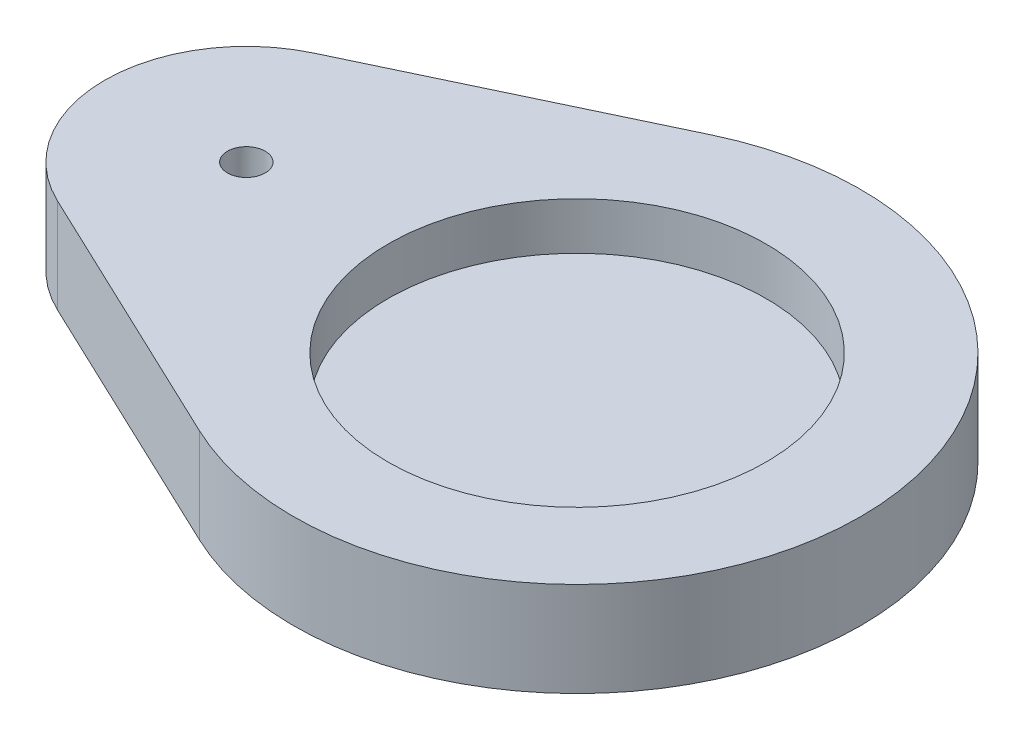
ISO-10303-21;
HEADER;
FILE_DESCRIPTION(('STEP AP214'),'2;1');
FILE_NAME('part.step','',(''),(''),'','','');
FILE_SCHEMA(('AUTOMOTIVE_DESIGN { 1 0 10303 214 1 1 1 1 }'));
ENDSEC;
DATA;
#1=APPLICATION_CONTEXT('core data for automotive mechanical design processes');
#2=APPLICATION_PROTOCOL_DEFINITION('international standard','automotive_design',2000,#1);
#3=PRODUCT_CONTEXT('',#1,'mechanical');
#4=PRODUCT('Part','Part','',(#3));
#5=PRODUCT_RELATED_PRODUCT_CATEGORY('part','',(#4));
#6=PRODUCT_DEFINITION_FORMATION('','',#4);
#7=PRODUCT_DEFINITION_CONTEXT('part definition',#1,'design');
#8=PRODUCT_DEFINITION('design','',#6,#7);
#9=PRODUCT_DEFINITION_SHAPE('','',#8);
#10=(LENGTH_UNIT() NAMED_UNIT(*) SI_UNIT(.MILLI.,.METRE.));
#11=(NAMED_UNIT(*) PLANE_ANGLE_UNIT() SI_UNIT($,.RADIAN.));
#12=(NAMED_UNIT(*) SI_UNIT($,.STERADIAN.) SOLID_ANGLE_UNIT());
#13=UNCERTAINTY_MEASURE_WITH_UNIT(LENGTH_MEASURE(1.E-05),#10,'distance_accuracy_value','');
#14=(GEOMETRIC_REPRESENTATION_CONTEXT(3) GLOBAL_UNCERTAINTY_ASSIGNED_CONTEXT((#13)) GLOBAL_UNIT_ASSIGNED_CONTEXT((#10,
#11,#12)) REPRESENTATION_CONTEXT('',''));
#15=CARTESIAN_POINT('',(0.,0.,0.));
#16=DIRECTION('',(0.,0.,1.));
#17=DIRECTION('',(1.,0.,0.));
#18=AXIS2_PLACEMENT_3D('',#15,#16,#17);
#19=CARTESIAN_POINT('',(-70.,20.,0.));
#20=DIRECTION('',(0.,-1.,0.));
#21=DIRECTION('',(0.,0.,-1.));
#22=AXIS2_PLACEMENT_3D('',#19,#20,#21);
#23=CYLINDRICAL_SURFACE('',#22,4.00000000000001);
#24=CARTESIAN_POINT('',(-70.,20.,0.));
#25=DIRECTION('',(0.,1.,0.));
#26=DIRECTION('',(0.,0.,1.));
#27=AXIS2_PLACEMENT_3D('',#24,#25,#26);
#28=CIRCLE('',#27,4.00000000000001);
#29=CARTESIAN_POINT('',(-70.,20.,4.00000000000001));
#30=VERTEX_POINT('',#29);
#31=EDGE_CURVE('E106',#30,#30,#28,.T.);
#32=ORIENTED_EDGE('',*,*,#31,.T.);
#33=EDGE_LOOP('',(#32));
#34=FACE_BOUND('',#33,.T.);
#35=CARTESIAN_POINT('',(-70.,5.,0.));
#36=DIRECTION('',(0.,-1.,0.));
#37=DIRECTION('',(0.,0.,-1.));
#38=AXIS2_PLACEMENT_3D('',#35,#36,#37);
#39=CIRCLE('',#38,4.00000000000001);
#40=CARTESIAN_POINT('',(-70.,5.,-4.00000000000001));
#41=VERTEX_POINT('',#40);
#42=EDGE_CURVE('E37',#41,#41,#39,.T.);
#43=ORIENTED_EDGE('',*,*,#42,.T.);
#44=EDGE_LOOP('',(#43));
#45=FACE_BOUND('',#44,.T.);
#46=ADVANCED_FACE('F33',(#34,#45),#23,.F.);
#47=CARTESIAN_POINT('',(0.,20.,0.));
#48=DIRECTION('',(0.,-1.,0.));
#49=DIRECTION('',(0.,0.,-1.));
#50=AXIS2_PLACEMENT_3D('',#47,#48,#49);
#51=CYLINDRICAL_SURFACE('',#50,60.);
#52=CARTESIAN_POINT('',(0.,20.,0.));
#53=DIRECTION('',(0.,1.,0.));
#54=DIRECTION('',(0.,0.,1.));
#55=AXIS2_PLACEMENT_3D('',#52,#53,#54);
#56=CIRCLE('',#55,60.);
#57=CARTESIAN_POINT('',(-25.7142857142857,20.,54.2104741743151));
#58=VERTEX_POINT('',#57);
#59=CARTESIAN_POINT('',(-25.7142857142857,20.,-54.2104741743151));
#60=VERTEX_POINT('',#59);
#61=EDGE_CURVE('E11',#58,#60,#56,.T.);
#62=ORIENTED_EDGE('',*,*,#61,.F.);
#63=DIRECTION('',(0.,-1.,0.));
#64=VECTOR('',#63,1.);
#65=CARTESIAN_POINT('',(-25.7142857142857,20.,54.2104741743151));
#66=LINE('',#65,#64);
#67=CARTESIAN_POINT('',(-25.7142857142857,0.,54.2104741743151));
#68=VERTEX_POINT('',#67);
#69=EDGE_CURVE('E79',#58,#68,#66,.T.);
#70=ORIENTED_EDGE('',*,*,#69,.T.);
#71=CARTESIAN_POINT('',(0.,0.,0.));
#72=DIRECTION('',(0.,1.,0.));
#73=DIRECTION('',(0.,0.,1.));
#74=AXIS2_PLACEMENT_3D('',#71,#72,#73);
#75=CIRCLE('',#74,60.);
#76=CARTESIAN_POINT('',(-25.7142857142857,0.,-54.2104741743151));
#77=VERTEX_POINT('',#76);
#78=EDGE_CURVE('E42',#68,#77,#75,.T.);
#79=ORIENTED_EDGE('',*,*,#78,.T.);
#80=DIRECTION('',(0.,-1.,0.));
#81=VECTOR('',#80,1.);
#82=CARTESIAN_POINT('',(-25.7142857142857,20.,-54.2104741743151));
#83=LINE('',#82,#81);
#84=EDGE_CURVE('E53',#60,#77,#83,.T.);
#85=ORIENTED_EDGE('',*,*,#84,.F.);
#86=EDGE_LOOP('',(#62,#70,#79,#85));
#87=FACE_BOUND('',#86,.T.);
#88=ADVANCED_FACE('F35',(#87),#51,.T.);
#89=CARTESIAN_POINT('',(0.,20.,0.));
#90=DIRECTION('',(0.,1.,0.));
#91=DIRECTION('',(0.,0.,1.));
#92=AXIS2_PLACEMENT_3D('',#89,#90,#91);
#93=PLANE('',#92);
#94=CARTESIAN_POINT('',(0.,20.,0.));
#95=DIRECTION('',(0.,1.,0.));
#96=DIRECTION('',(0.,0.,1.));
#97=AXIS2_PLACEMENT_3D('',#94,#95,#96);
#98=CIRCLE('',#97,40.);
#99=CARTESIAN_POINT('',(0.,20.,40.));
#100=VERTEX_POINT('',#99);
#101=EDGE_CURVE('E111',#100,#100,#98,.T.);
#102=ORIENTED_EDGE('',*,*,#101,.F.);
#103=EDGE_LOOP('',(#102));
#104=FACE_BOUND('',#103,.T.);
#105=ORIENTED_EDGE('',*,*,#61,.T.);
#106=DIRECTION('',(-0.903507902905251,0.,0.428571428571428));
#107=VECTOR('',#106,1.);
#108=CARTESIAN_POINT('',(-82.8571428571429,20.,-27.1052370871575));
#109=LINE('',#108,#107);
#110=CARTESIAN_POINT('',(-82.8571428571429,20.,-27.1052370871575));
#111=VERTEX_POINT('',#110);
#112=EDGE_CURVE('E81',#60,#111,#109,.T.);
#113=ORIENTED_EDGE('',*,*,#112,.T.);
#114=CARTESIAN_POINT('',(-70.,20.,0.));
#115=DIRECTION('',(0.,1.,0.));
#116=DIRECTION('',(0.,0.,1.));
#117=AXIS2_PLACEMENT_3D('',#114,#115,#116);
#118=CIRCLE('',#117,30.);
#119=CARTESIAN_POINT('',(-82.8571428571428,20.,27.1052370871575));
#120=VERTEX_POINT('',#119);
#121=EDGE_CURVE('E82',#111,#120,#118,.T.);
#122=ORIENTED_EDGE('',*,*,#121,.T.);
#123=DIRECTION('',(0.903507902905251,0.,0.428571428571429));
#124=VECTOR('',#123,1.);
#125=CARTESIAN_POINT('',(-82.8571428571428,20.,27.1052370871575));
#126=LINE('',#125,#124);
#127=EDGE_CURVE('E72',#120,#58,#126,.T.);
#128=ORIENTED_EDGE('',*,*,#127,.T.);
#129=EDGE_LOOP('',(#105,#113,#122,#128));
#130=FACE_BOUND('',#129,.T.);
#131=ORIENTED_EDGE('',*,*,#31,.F.);
#132=EDGE_LOOP('',(#131));
#133=FACE_BOUND('',#132,.T.);
#134=ADVANCED_FACE('F85',(#104,#130,#133),#93,.T.);
#135=CARTESIAN_POINT('',(0.,0.,0.));
#136=DIRECTION('',(0.,1.,0.));
#137=DIRECTION('',(0.,0.,1.));
#138=AXIS2_PLACEMENT_3D('',#135,#136,#137);
#139=PLANE('',#138);
#140=CARTESIAN_POINT('',(-70.,0.,0.));
#141=DIRECTION('',(0.,-1.,0.));
#142=DIRECTION('',(0.,0.,-1.));
#143=AXIS2_PLACEMENT_3D('',#140,#141,#142);
#144=CIRCLE('',#143,12.);
#145=CARTESIAN_POINT('',(-70.,0.,-12.));
#146=VERTEX_POINT('',#145);
#147=EDGE_CURVE('E116',#146,#146,#144,.T.);
#148=ORIENTED_EDGE('',*,*,#147,.F.);
#149=EDGE_LOOP('',(#148));
#150=FACE_BOUND('',#149,.T.);
#151=ORIENTED_EDGE('',*,*,#78,.F.);
#152=DIRECTION('',(0.903507902905251,0.,0.428571428571429));
#153=VECTOR('',#152,1.);
#154=CARTESIAN_POINT('',(-82.8571428571428,0.,27.1052370871575));
#155=LINE('',#154,#153);
#156=CARTESIAN_POINT('',(-82.8571428571428,0.,27.1052370871575));
#157=VERTEX_POINT('',#156);
#158=EDGE_CURVE('E103',#157,#68,#155,.T.);
#159=ORIENTED_EDGE('',*,*,#158,.F.);
#160=CARTESIAN_POINT('',(-70.,0.,0.));
#161=DIRECTION('',(0.,1.,0.));
#162=DIRECTION('',(0.,0.,1.));
#163=AXIS2_PLACEMENT_3D('',#160,#161,#162);
#164=CIRCLE('',#163,30.);
#165=CARTESIAN_POINT('',(-82.8571428571429,0.,-27.1052370871575));
#166=VERTEX_POINT('',#165);
#167=EDGE_CURVE('E95',#166,#157,#164,.T.);
#168=ORIENTED_EDGE('',*,*,#167,.F.);
#169=DIRECTION('',(-0.903507902905251,0.,0.428571428571428));
#170=VECTOR('',#169,1.);
#171=CARTESIAN_POINT('',(-82.8571428571429,0.,-27.1052370871575));
#172=LINE('',#171,#170);
#173=EDGE_CURVE('E91',#77,#166,#172,.T.);
#174=ORIENTED_EDGE('',*,*,#173,.F.);
#175=EDGE_LOOP('',(#151,#159,#168,#174));
#176=FACE_BOUND('',#175,.T.);
#177=ADVANCED_FACE('F155',(#150,#176),#139,.F.);
#178=CARTESIAN_POINT('',(-70.,20.,0.));
#179=DIRECTION('',(0.,-1.,0.));
#180=DIRECTION('',(0.,0.,-1.));
#181=AXIS2_PLACEMENT_3D('',#178,#179,#180);
#182=CYLINDRICAL_SURFACE('',#181,30.);
#183=ORIENTED_EDGE('',*,*,#167,.T.);
#184=DIRECTION('',(0.,-1.,0.));
#185=VECTOR('',#184,1.);
#186=CARTESIAN_POINT('',(-82.8571428571428,20.,27.1052370871575));
#187=LINE('',#186,#185);
#188=EDGE_CURVE('E77',#120,#157,#187,.T.);
#189=ORIENTED_EDGE('',*,*,#188,.F.);
#190=ORIENTED_EDGE('',*,*,#121,.F.);
#191=DIRECTION('',(0.,-1.,0.));
#192=VECTOR('',#191,1.);
#193=CARTESIAN_POINT('',(-82.8571428571429,20.,-27.1052370871575));
#194=LINE('',#193,#192);
#195=EDGE_CURVE('E100',#111,#166,#194,.T.);
#196=ORIENTED_EDGE('',*,*,#195,.T.);
#197=EDGE_LOOP('',(#183,#189,#190,#196));
#198=FACE_BOUND('',#197,.T.);
#199=ADVANCED_FACE('F93',(#198),#182,.T.);
#200=CARTESIAN_POINT('',(-82.8571428571428,20.,27.1052370871575));
#201=DIRECTION('',(0.428571428571429,0.,-0.903507902905251));
#202=DIRECTION('',(-0.903507902905251,0.,-0.428571428571429));
#203=AXIS2_PLACEMENT_3D('',#200,#201,#202);
#204=PLANE('',#203);
#205=ORIENTED_EDGE('',*,*,#158,.T.);
#206=ORIENTED_EDGE('',*,*,#69,.F.);
#207=ORIENTED_EDGE('',*,*,#127,.F.);
#208=ORIENTED_EDGE('',*,*,#188,.T.);
#209=EDGE_LOOP('',(#205,#206,#207,#208));
#210=FACE_BOUND('',#209,.T.);
#211=ADVANCED_FACE('F75',(#210),#204,.F.);
#212=CARTESIAN_POINT('',(-82.8571428571429,20.,-27.1052370871575));
#213=DIRECTION('',(0.428571428571428,0.,0.903507902905251));
#214=DIRECTION('',(0.903507902905251,0.,-0.428571428571428));
#215=AXIS2_PLACEMENT_3D('',#212,#213,#214);
#216=PLANE('',#215);
#217=ORIENTED_EDGE('',*,*,#173,.T.);
#218=ORIENTED_EDGE('',*,*,#195,.F.);
#219=ORIENTED_EDGE('',*,*,#112,.F.);
#220=ORIENTED_EDGE('',*,*,#84,.T.);
#221=EDGE_LOOP('',(#217,#218,#219,#220));
#222=FACE_BOUND('',#221,.T.);
#223=ADVANCED_FACE('F147',(#222),#216,.F.);
#224=CARTESIAN_POINT('',(0.,10.,0.));
#225=DIRECTION('',(0.,1.,0.));
#226=DIRECTION('',(0.,0.,1.));
#227=AXIS2_PLACEMENT_3D('',#224,#225,#226);
#228=CYLINDRICAL_SURFACE('',#227,40.);
#229=CARTESIAN_POINT('',(0.,10.,0.));
#230=DIRECTION('',(0.,1.,0.));
#231=DIRECTION('',(0.,0.,1.));
#232=AXIS2_PLACEMENT_3D('',#229,#230,#231);
#233=CIRCLE('',#232,40.);
#234=CARTESIAN_POINT('',(0.,10.,40.));
#235=VERTEX_POINT('',#234);
#236=EDGE_CURVE('E110',#235,#235,#233,.T.);
#237=ORIENTED_EDGE('',*,*,#236,.F.);
#238=EDGE_LOOP('',(#237));
#239=FACE_BOUND('',#238,.T.);
#240=ORIENTED_EDGE('',*,*,#101,.T.);
#241=EDGE_LOOP('',(#240));
#242=FACE_BOUND('',#241,.T.);
#243=ADVANCED_FACE('F145',(#239,#242),#228,.F.);
#244=CARTESIAN_POINT('',(0.,10.,0.));
#245=DIRECTION('',(0.,1.,0.));
#246=DIRECTION('',(0.,0.,1.));
#247=AXIS2_PLACEMENT_3D('',#244,#245,#246);
#248=PLANE('',#247);
#249=ORIENTED_EDGE('',*,*,#236,.T.);
#250=EDGE_LOOP('',(#249));
#251=FACE_BOUND('',#250,.T.);
#252=ADVANCED_FACE('F134',(#251),#248,.T.);
#253=CARTESIAN_POINT('',(-70.,5.,0.));
#254=DIRECTION('',(0.,-1.,0.));
#255=DIRECTION('',(0.,0.,-1.));
#256=AXIS2_PLACEMENT_3D('',#253,#254,#255);
#257=CYLINDRICAL_SURFACE('',#256,12.);
#258=CARTESIAN_POINT('',(-70.,5.,0.));
#259=DIRECTION('',(0.,-1.,0.));
#260=DIRECTION('',(0.,0.,-1.));
#261=AXIS2_PLACEMENT_3D('',#258,#259,#260);
#262=CIRCLE('',#261,12.);
#263=CARTESIAN_POINT('',(-70.,5.,-12.));
#264=VERTEX_POINT('',#263);
#265=EDGE_CURVE('E119',#264,#264,#262,.T.);
#266=ORIENTED_EDGE('',*,*,#265,.F.);
#267=EDGE_LOOP('',(#266));
#268=FACE_BOUND('',#267,.T.);
#269=ORIENTED_EDGE('',*,*,#147,.T.);
#270=EDGE_LOOP('',(#269));
#271=FACE_BOUND('',#270,.T.);
#272=ADVANCED_FACE('F129',(#268,#271),#257,.F.);
#273=CARTESIAN_POINT('',(-70.,5.,0.));
#274=DIRECTION('',(0.,-1.,0.));
#275=DIRECTION('',(0.,0.,-1.));
#276=AXIS2_PLACEMENT_3D('',#273,#274,#275);
#277=PLANE('',#276);
#278=ORIENTED_EDGE('',*,*,#42,.F.);
#279=EDGE_LOOP('',(#278));
#280=FACE_BOUND('',#279,.T.);
#281=ORIENTED_EDGE('',*,*,#265,.T.);
#282=EDGE_LOOP('',(#281));
#283=FACE_BOUND('',#282,.T.);
#284=ADVANCED_FACE('F127',(#280,#283),#277,.T.);
#285=CLOSED_SHELL('',(#46,#88,#134,#177,#199,#211,#223,#243,#252,#272,#284));
#286=MANIFOLD_SOLID_BREP('B2',#285);
#287=ADVANCED_BREP_SHAPE_REPRESENTATION('',(#18,#286),#14);
#288=SHAPE_DEFINITION_REPRESENTATION(#9,#287);
ENDSEC;
END-ISO-10303-21;
